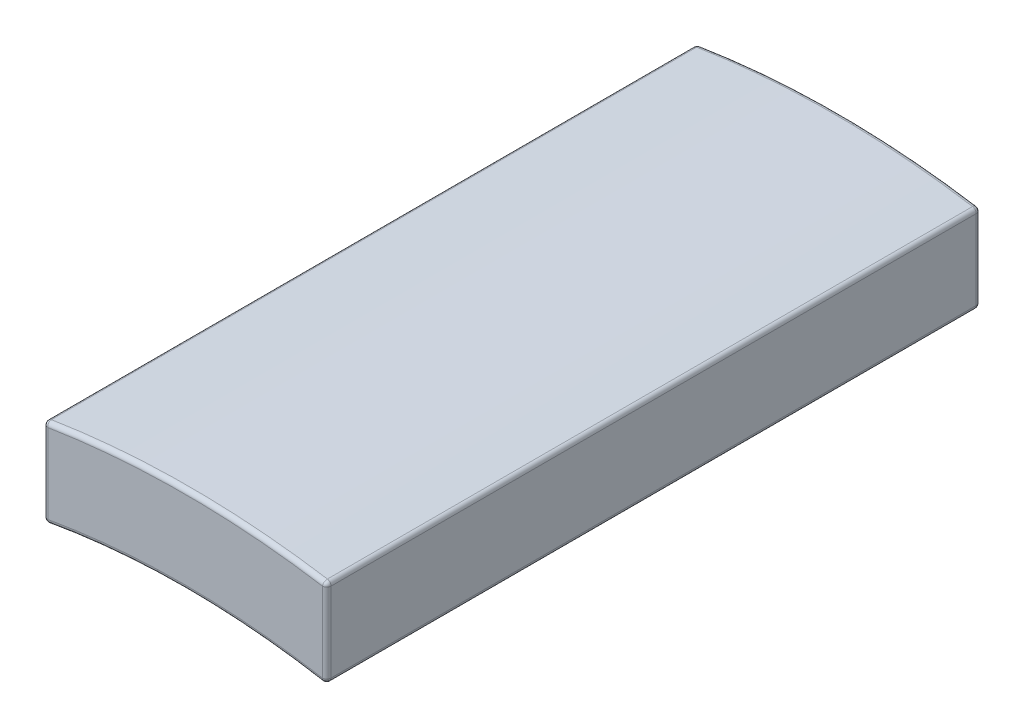
ISO-10303-21;
HEADER;
FILE_DESCRIPTION(('STEP AP214'),'2;1');
FILE_NAME('part.step','',(''),(''),'','','');
FILE_SCHEMA(('AUTOMOTIVE_DESIGN { 1 0 10303 214 1 1 1 1 }'));
ENDSEC;
DATA;
#1=APPLICATION_CONTEXT('core data for automotive mechanical design processes');
#2=APPLICATION_PROTOCOL_DEFINITION('international standard','automotive_design',2000,#1);
#3=PRODUCT_CONTEXT('',#1,'mechanical');
#4=PRODUCT('Part','Part','',(#3));
#5=PRODUCT_RELATED_PRODUCT_CATEGORY('part','',(#4));
#6=PRODUCT_DEFINITION_FORMATION('','',#4);
#7=PRODUCT_DEFINITION_CONTEXT('part definition',#1,'design');
#8=PRODUCT_DEFINITION('design','',#6,#7);
#9=PRODUCT_DEFINITION_SHAPE('','',#8);
#10=(LENGTH_UNIT() NAMED_UNIT(*) SI_UNIT(.MILLI.,.METRE.));
#11=(NAMED_UNIT(*) PLANE_ANGLE_UNIT() SI_UNIT($,.RADIAN.));
#12=(NAMED_UNIT(*) SI_UNIT($,.STERADIAN.) SOLID_ANGLE_UNIT());
#13=UNCERTAINTY_MEASURE_WITH_UNIT(LENGTH_MEASURE(1.E-05),#10,'distance_accuracy_value','');
#14=(GEOMETRIC_REPRESENTATION_CONTEXT(3) GLOBAL_UNCERTAINTY_ASSIGNED_CONTEXT((#13)) GLOBAL_UNIT_ASSIGNED_CONTEXT((#10,
#11,#12)) REPRESENTATION_CONTEXT('',''));
#15=CARTESIAN_POINT('',(0.,0.,0.));
#16=DIRECTION('',(0.,0.,1.));
#17=DIRECTION('',(1.,0.,0.));
#18=AXIS2_PLACEMENT_3D('',#15,#16,#17);
#19=CARTESIAN_POINT('',(0.,0.,0.1));
#20=DIRECTION('',(0.,0.,1.));
#21=DIRECTION('',(1.,0.,0.));
#22=AXIS2_PLACEMENT_3D('',#19,#20,#21);
#23=TOROIDAL_SURFACE('',#22,18.15,0.1);
#24=CARTESIAN_POINT('',(-3.15,17.8745629317195,0.1));
#25=DIRECTION('',(0.984824403951484,0.173553719008276,0.));
#26=DIRECTION('',(-0.173553719008276,0.984824403951484,0.));
#27=AXIS2_PLACEMENT_3D('',#24,#25,#26);
#28=CIRCLE('',#27,0.1);
#29=CARTESIAN_POINT('',(-3.13264462809917,17.7760804913244,0.1));
#30=VERTEX_POINT('',#29);
#31=CARTESIAN_POINT('',(-3.15,17.8745629317195,0.));
#32=VERTEX_POINT('',#31);
#33=EDGE_CURVE('E28',#30,#32,#28,.T.);
#34=ORIENTED_EDGE('',*,*,#33,.T.);
#35=CARTESIAN_POINT('',(0.,0.,0.));
#36=DIRECTION('',(0.,0.,1.));
#37=DIRECTION('',(1.,0.,0.));
#38=AXIS2_PLACEMENT_3D('',#35,#36,#37);
#39=CIRCLE('',#38,18.15);
#40=CARTESIAN_POINT('',(3.15,17.8745629317195,0.));
#41=VERTEX_POINT('',#40);
#42=EDGE_CURVE('E204',#41,#32,#39,.T.);
#43=ORIENTED_EDGE('',*,*,#42,.F.);
#44=CARTESIAN_POINT('',(3.15,17.8745629317195,0.1));
#45=DIRECTION('',(-0.984824403951486,0.173553719008268,0.));
#46=DIRECTION('',(-0.173553719008268,-0.984824403951486,0.));
#47=AXIS2_PLACEMENT_3D('',#44,#45,#46);
#48=CIRCLE('',#47,0.1);
#49=CARTESIAN_POINT('',(3.13264462809917,17.7760804913244,0.1));
#50=VERTEX_POINT('',#49);
#51=EDGE_CURVE('E11',#41,#50,#48,.T.);
#52=ORIENTED_EDGE('',*,*,#51,.T.);
#53=CARTESIAN_POINT('',(0.,0.,0.1));
#54=DIRECTION('',(0.,0.,-1.));
#55=DIRECTION('',(1.,0.,0.));
#56=AXIS2_PLACEMENT_3D('',#53,#54,#55);
#57=CIRCLE('',#56,18.05);
#58=EDGE_CURVE('E199',#30,#50,#57,.T.);
#59=ORIENTED_EDGE('',*,*,#58,.F.);
#60=EDGE_LOOP('',(#34,#43,#52,#59));
#61=FACE_BOUND('',#60,.T.);
#62=ADVANCED_FACE('F17',(#61),#23,.T.);
#63=CARTESIAN_POINT('',(3.15,17.8745629317195,0.1));
#64=DIRECTION('',(0.,1.,0.));
#65=DIRECTION('',(1.,0.,0.));
#66=AXIS2_PLACEMENT_3D('',#63,#64,#65);
#67=SPHERICAL_SURFACE('',#66,0.1);
#68=CARTESIAN_POINT('',(3.15,17.8745629317195,0.1));
#69=DIRECTION('',(0.,-1.,0.));
#70=DIRECTION('',(0.,0.,-1.));
#71=AXIS2_PLACEMENT_3D('',#68,#69,#70);
#72=CIRCLE('',#71,0.1);
#73=CARTESIAN_POINT('',(3.25,17.8745629317195,0.1));
#74=VERTEX_POINT('',#73);
#75=EDGE_CURVE('E242',#41,#74,#72,.T.);
#76=ORIENTED_EDGE('',*,*,#75,.T.);
#77=CARTESIAN_POINT('',(3.15,17.8745629317195,0.1));
#78=DIRECTION('',(0.,0.,1.));
#79=DIRECTION('',(-1.,0.,0.));
#80=AXIS2_PLACEMENT_3D('',#77,#78,#79);
#81=CIRCLE('',#80,0.1);
#82=EDGE_CURVE('E241',#50,#74,#81,.T.);
#83=ORIENTED_EDGE('',*,*,#82,.F.);
#84=ORIENTED_EDGE('',*,*,#51,.F.);
#85=EDGE_LOOP('',(#76,#83,#84));
#86=FACE_BOUND('',#85,.T.);
#87=ADVANCED_FACE('F293',(#86),#67,.T.);
#88=CARTESIAN_POINT('',(-3.15,17.8745629317195,0.1));
#89=DIRECTION('',(0.,1.,0.));
#90=DIRECTION('',(1.,0.,0.));
#91=AXIS2_PLACEMENT_3D('',#88,#89,#90);
#92=SPHERICAL_SURFACE('',#91,0.1);
#93=CARTESIAN_POINT('',(-3.15,17.8745629317195,0.1));
#94=DIRECTION('',(0.,0.,1.));
#95=DIRECTION('',(-1.,0.,0.));
#96=AXIS2_PLACEMENT_3D('',#93,#94,#95);
#97=CIRCLE('',#96,0.1);
#98=CARTESIAN_POINT('',(-3.25,17.8745629317195,0.1));
#99=VERTEX_POINT('',#98);
#100=EDGE_CURVE('E196',#99,#30,#97,.T.);
#101=ORIENTED_EDGE('',*,*,#100,.F.);
#102=CARTESIAN_POINT('',(-3.15,17.8745629317195,0.1));
#103=DIRECTION('',(0.,-1.,0.));
#104=DIRECTION('',(0.,0.,-1.));
#105=AXIS2_PLACEMENT_3D('',#102,#103,#104);
#106=CIRCLE('',#105,0.1);
#107=EDGE_CURVE('E140',#99,#32,#106,.T.);
#108=ORIENTED_EDGE('',*,*,#107,.T.);
#109=ORIENTED_EDGE('',*,*,#33,.F.);
#110=EDGE_LOOP('',(#101,#108,#109));
#111=FACE_BOUND('',#110,.T.);
#112=ADVANCED_FACE('F515',(#111),#92,.T.);
#113=CARTESIAN_POINT('',(3.15,17.8745629317195,0.1));
#114=DIRECTION('',(0.,1.,0.));
#115=DIRECTION('',(0.,0.,1.));
#116=AXIS2_PLACEMENT_3D('',#113,#114,#115);
#117=CYLINDRICAL_SURFACE('',#116,0.1);
#118=CARTESIAN_POINT('',(3.15,19.6997461912584,0.1));
#119=DIRECTION('',(0.,-1.,0.));
#120=DIRECTION('',(0.,0.,-1.));
#121=AXIS2_PLACEMENT_3D('',#118,#119,#120);
#122=CIRCLE('',#121,0.1);
#123=CARTESIAN_POINT('',(3.15,19.6997461912584,0.));
#124=VERTEX_POINT('',#123);
#125=CARTESIAN_POINT('',(3.25,19.6997461912584,0.1));
#126=VERTEX_POINT('',#125);
#127=EDGE_CURVE('E132',#124,#126,#122,.T.);
#128=ORIENTED_EDGE('',*,*,#127,.T.);
#129=DIRECTION('',(0.,1.,0.));
#130=VECTOR('',#129,1.);
#131=CARTESIAN_POINT('',(3.25,17.8745629317195,0.1));
#132=LINE('',#131,#130);
#133=EDGE_CURVE('E273',#74,#126,#132,.T.);
#134=ORIENTED_EDGE('',*,*,#133,.F.);
#135=ORIENTED_EDGE('',*,*,#75,.F.);
#136=DIRECTION('',(0.,-1.,0.));
#137=VECTOR('',#136,1.);
#138=CARTESIAN_POINT('',(3.15,17.8745629317195,0.));
#139=LINE('',#138,#137);
#140=EDGE_CURVE('E214',#124,#41,#139,.T.);
#141=ORIENTED_EDGE('',*,*,#140,.F.);
#142=EDGE_LOOP('',(#128,#134,#135,#141));
#143=FACE_BOUND('',#142,.T.);
#144=ADVANCED_FACE('F299',(#143),#117,.T.);
#145=CARTESIAN_POINT('',(-3.15,17.8745629317195,0.1));
#146=DIRECTION('',(0.,-1.,0.));
#147=DIRECTION('',(0.,0.,-1.));
#148=AXIS2_PLACEMENT_3D('',#145,#146,#147);
#149=CYLINDRICAL_SURFACE('',#148,0.1);
#150=CARTESIAN_POINT('',(-3.15,19.6997461912584,0.1));
#151=DIRECTION('',(0.,-1.,0.));
#152=DIRECTION('',(0.,0.,-1.));
#153=AXIS2_PLACEMENT_3D('',#150,#151,#152);
#154=CIRCLE('',#153,0.1);
#155=CARTESIAN_POINT('',(-3.25,19.6997461912584,0.1));
#156=VERTEX_POINT('',#155);
#157=CARTESIAN_POINT('',(-3.15,19.6997461912584,0.));
#158=VERTEX_POINT('',#157);
#159=EDGE_CURVE('E43',#156,#158,#154,.T.);
#160=ORIENTED_EDGE('',*,*,#159,.T.);
#161=DIRECTION('',(0.,1.,0.));
#162=VECTOR('',#161,1.);
#163=CARTESIAN_POINT('',(-3.15,17.8745629317195,0.));
#164=LINE('',#163,#162);
#165=EDGE_CURVE('E200',#32,#158,#164,.T.);
#166=ORIENTED_EDGE('',*,*,#165,.F.);
#167=ORIENTED_EDGE('',*,*,#107,.F.);
#168=DIRECTION('',(0.,-1.,0.));
#169=VECTOR('',#168,1.);
#170=CARTESIAN_POINT('',(-3.25,17.8745629317195,0.1));
#171=LINE('',#170,#169);
#172=EDGE_CURVE('E136',#156,#99,#171,.T.);
#173=ORIENTED_EDGE('',*,*,#172,.F.);
#174=EDGE_LOOP('',(#160,#166,#167,#173));
#175=FACE_BOUND('',#174,.T.);
#176=ADVANCED_FACE('F138',(#175),#149,.T.);
#177=CARTESIAN_POINT('',(3.15,19.6997461912584,0.1));
#178=DIRECTION('',(0.,1.,0.));
#179=DIRECTION('',(1.,0.,0.));
#180=AXIS2_PLACEMENT_3D('',#177,#178,#179);
#181=SPHERICAL_SURFACE('',#180,0.1);
#182=CARTESIAN_POINT('',(3.15,19.6997461912584,0.1));
#183=DIRECTION('',(0.987455949436511,-0.157894736842109,0.));
#184=DIRECTION('',(0.157894736842109,0.987455949436511,0.));
#185=AXIS2_PLACEMENT_3D('',#182,#183,#184);
#186=CIRCLE('',#185,0.1);
#187=CARTESIAN_POINT('',(3.16578947368421,19.798491786202,0.1));
#188=VERTEX_POINT('',#187);
#189=EDGE_CURVE('E133',#124,#188,#186,.T.);
#190=ORIENTED_EDGE('',*,*,#189,.T.);
#191=CARTESIAN_POINT('',(3.15,19.6997461912584,0.1));
#192=DIRECTION('',(0.,0.,1.));
#193=DIRECTION('',(-1.,0.,0.));
#194=AXIS2_PLACEMENT_3D('',#191,#192,#193);
#195=CIRCLE('',#194,0.0999999999999981);
#196=EDGE_CURVE('E184',#126,#188,#195,.T.);
#197=ORIENTED_EDGE('',*,*,#196,.F.);
#198=ORIENTED_EDGE('',*,*,#127,.F.);
#199=EDGE_LOOP('',(#190,#197,#198));
#200=FACE_BOUND('',#199,.T.);
#201=ADVANCED_FACE('F492',(#200),#181,.T.);
#202=CARTESIAN_POINT('',(-3.15,19.6997461912584,0.1));
#203=DIRECTION('',(0.,1.,0.));
#204=DIRECTION('',(1.,0.,0.));
#205=AXIS2_PLACEMENT_3D('',#202,#203,#204);
#206=SPHERICAL_SURFACE('',#205,0.1);
#207=CARTESIAN_POINT('',(-3.15,19.6997461912584,0.1));
#208=DIRECTION('',(0.,0.,1.));
#209=DIRECTION('',(-1.,0.,0.));
#210=AXIS2_PLACEMENT_3D('',#207,#208,#209);
#211=CIRCLE('',#210,0.0999999999999981);
#212=CARTESIAN_POINT('',(-3.16578947368421,19.798491786202,0.1));
#213=VERTEX_POINT('',#212);
#214=EDGE_CURVE('E128',#213,#156,#211,.T.);
#215=ORIENTED_EDGE('',*,*,#214,.F.);
#216=CARTESIAN_POINT('',(-3.15,19.6997461912584,0.1));
#217=DIRECTION('',(-0.987455949436512,-0.157894736842104,0.));
#218=DIRECTION('',(0.157894736842104,-0.987455949436512,0.));
#219=AXIS2_PLACEMENT_3D('',#216,#217,#218);
#220=CIRCLE('',#219,0.1);
#221=EDGE_CURVE('E21',#213,#158,#220,.T.);
#222=ORIENTED_EDGE('',*,*,#221,.T.);
#223=ORIENTED_EDGE('',*,*,#159,.F.);
#224=EDGE_LOOP('',(#215,#222,#223));
#225=FACE_BOUND('',#224,.T.);
#226=ADVANCED_FACE('F126',(#225),#206,.T.);
#227=CARTESIAN_POINT('',(0.,0.,0.1));
#228=DIRECTION('',(0.,0.,1.));
#229=DIRECTION('',(1.,0.,0.));
#230=AXIS2_PLACEMENT_3D('',#227,#228,#229);
#231=TOROIDAL_SURFACE('',#230,19.95,0.1);
#232=ORIENTED_EDGE('',*,*,#221,.F.);
#233=CARTESIAN_POINT('',(0.,0.,0.1));
#234=DIRECTION('',(0.,0.,1.));
#235=DIRECTION('',(1.,0.,0.));
#236=AXIS2_PLACEMENT_3D('',#233,#234,#235);
#237=CIRCLE('',#236,20.05);
#238=EDGE_CURVE('E245',#188,#213,#237,.T.);
#239=ORIENTED_EDGE('',*,*,#238,.F.);
#240=ORIENTED_EDGE('',*,*,#189,.F.);
#241=CARTESIAN_POINT('',(0.,0.,0.));
#242=DIRECTION('',(0.,0.,-1.));
#243=DIRECTION('',(1.,0.,0.));
#244=AXIS2_PLACEMENT_3D('',#241,#242,#243);
#245=CIRCLE('',#244,19.95);
#246=EDGE_CURVE('E203',#158,#124,#245,.T.);
#247=ORIENTED_EDGE('',*,*,#246,.F.);
#248=EDGE_LOOP('',(#232,#239,#240,#247));
#249=FACE_BOUND('',#248,.T.);
#250=ADVANCED_FACE('F491',(#249),#231,.T.);
#251=CARTESIAN_POINT('',(-3.15,17.8745629317195,14.9));
#252=DIRECTION('',(0.,1.,0.));
#253=DIRECTION('',(0.,0.,1.));
#254=AXIS2_PLACEMENT_3D('',#251,#252,#253);
#255=CYLINDRICAL_SURFACE('',#254,0.1);
#256=CARTESIAN_POINT('',(-3.15,19.6997461912584,14.9));
#257=DIRECTION('',(0.,-1.,0.));
#258=DIRECTION('',(0.,0.,-1.));
#259=AXIS2_PLACEMENT_3D('',#256,#257,#258);
#260=CIRCLE('',#259,0.1);
#261=CARTESIAN_POINT('',(-3.15,19.6997461912584,15.));
#262=VERTEX_POINT('',#261);
#263=CARTESIAN_POINT('',(-3.25,19.6997461912584,14.9));
#264=VERTEX_POINT('',#263);
#265=EDGE_CURVE('E235',#262,#264,#260,.T.);
#266=ORIENTED_EDGE('',*,*,#265,.T.);
#267=DIRECTION('',(0.,1.,0.));
#268=VECTOR('',#267,1.);
#269=CARTESIAN_POINT('',(-3.25,19.6997461912584,14.9));
#270=LINE('',#269,#268);
#271=CARTESIAN_POINT('',(-3.25,17.8745629317195,14.9));
#272=VERTEX_POINT('',#271);
#273=EDGE_CURVE('E145',#272,#264,#270,.T.);
#274=ORIENTED_EDGE('',*,*,#273,.F.);
#275=CARTESIAN_POINT('',(-3.15,17.8745629317195,14.9));
#276=DIRECTION('',(0.,1.,0.));
#277=DIRECTION('',(0.,0.,1.));
#278=AXIS2_PLACEMENT_3D('',#275,#276,#277);
#279=CIRCLE('',#278,0.1);
#280=CARTESIAN_POINT('',(-3.15,17.8745629317195,15.));
#281=VERTEX_POINT('',#280);
#282=EDGE_CURVE('E233',#272,#281,#279,.T.);
#283=ORIENTED_EDGE('',*,*,#282,.T.);
#284=DIRECTION('',(0.,-1.,0.));
#285=VECTOR('',#284,1.);
#286=CARTESIAN_POINT('',(-3.15,17.8745629317195,15.));
#287=LINE('',#286,#285);
#288=EDGE_CURVE('E185',#262,#281,#287,.T.);
#289=ORIENTED_EDGE('',*,*,#288,.F.);
#290=EDGE_LOOP('',(#266,#274,#283,#289));
#291=FACE_BOUND('',#290,.T.);
#292=ADVANCED_FACE('F600',(#291),#255,.T.);
#293=CARTESIAN_POINT('',(-3.15,17.8745629317195,14.9));
#294=DIRECTION('',(0.,1.,0.));
#295=DIRECTION('',(1.,0.,0.));
#296=AXIS2_PLACEMENT_3D('',#293,#294,#295);
#297=SPHERICAL_SURFACE('',#296,0.1);
#298=CARTESIAN_POINT('',(-3.15,17.8745629317195,14.9));
#299=DIRECTION('',(0.,0.,-1.));
#300=DIRECTION('',(-1.,0.,0.));
#301=AXIS2_PLACEMENT_3D('',#298,#299,#300);
#302=CIRCLE('',#301,0.1);
#303=CARTESIAN_POINT('',(-3.13264462809917,17.7760804913244,14.9));
#304=VERTEX_POINT('',#303);
#305=EDGE_CURVE('E195',#304,#272,#302,.T.);
#306=ORIENTED_EDGE('',*,*,#305,.F.);
#307=CARTESIAN_POINT('',(-3.15,17.8745629317195,14.9));
#308=DIRECTION('',(-0.984824403951486,-0.173553719008264,0.));
#309=DIRECTION('',(0.173553719008264,-0.984824403951486,0.));
#310=AXIS2_PLACEMENT_3D('',#307,#308,#309);
#311=CIRCLE('',#310,0.1);
#312=EDGE_CURVE('E172',#304,#281,#311,.T.);
#313=ORIENTED_EDGE('',*,*,#312,.T.);
#314=ORIENTED_EDGE('',*,*,#282,.F.);
#315=EDGE_LOOP('',(#306,#313,#314));
#316=FACE_BOUND('',#315,.T.);
#317=ADVANCED_FACE('F625',(#316),#297,.T.);
#318=CARTESIAN_POINT('',(-3.15,19.6997461912584,14.9));
#319=DIRECTION('',(0.,1.,0.));
#320=DIRECTION('',(1.,0.,0.));
#321=AXIS2_PLACEMENT_3D('',#318,#319,#320);
#322=SPHERICAL_SURFACE('',#321,0.1);
#323=CARTESIAN_POINT('',(-3.15,19.6997461912584,14.9));
#324=DIRECTION('',(-0.987455949436513,-0.157894736842095,0.));
#325=DIRECTION('',(0.157894736842095,-0.987455949436513,0.));
#326=AXIS2_PLACEMENT_3D('',#323,#324,#325);
#327=CIRCLE('',#326,0.1);
#328=CARTESIAN_POINT('',(-3.16578947368421,19.798491786202,14.9));
#329=VERTEX_POINT('',#328);
#330=EDGE_CURVE('E175',#262,#329,#327,.T.);
#331=ORIENTED_EDGE('',*,*,#330,.T.);
#332=CARTESIAN_POINT('',(-3.15,19.6997461912584,14.9));
#333=DIRECTION('',(0.,0.,-1.));
#334=DIRECTION('',(-1.,0.,0.));
#335=AXIS2_PLACEMENT_3D('',#332,#333,#334);
#336=CIRCLE('',#335,0.0999999999999981);
#337=EDGE_CURVE('E146',#264,#329,#336,.T.);
#338=ORIENTED_EDGE('',*,*,#337,.F.);
#339=ORIENTED_EDGE('',*,*,#265,.F.);
#340=EDGE_LOOP('',(#331,#338,#339));
#341=FACE_BOUND('',#340,.T.);
#342=ADVANCED_FACE('F630',(#341),#322,.T.);
#343=CARTESIAN_POINT('',(0.,0.,14.9));
#344=DIRECTION('',(0.,0.,1.));
#345=DIRECTION('',(1.,0.,0.));
#346=AXIS2_PLACEMENT_3D('',#343,#344,#345);
#347=TOROIDAL_SURFACE('',#346,18.15,0.1);
#348=CARTESIAN_POINT('',(3.15,17.8745629317195,14.9));
#349=DIRECTION('',(-0.984824403951486,0.173553719008268,0.));
#350=DIRECTION('',(-0.173553719008268,-0.984824403951486,0.));
#351=AXIS2_PLACEMENT_3D('',#348,#349,#350);
#352=CIRCLE('',#351,0.1);
#353=CARTESIAN_POINT('',(3.13264462809917,17.7760804913244,14.9));
#354=VERTEX_POINT('',#353);
#355=CARTESIAN_POINT('',(3.15,17.8745629317195,15.));
#356=VERTEX_POINT('',#355);
#357=EDGE_CURVE('E178',#354,#356,#352,.T.);
#358=ORIENTED_EDGE('',*,*,#357,.T.);
#359=CARTESIAN_POINT('',(0.,0.,15.));
#360=DIRECTION('',(0.,0.,-1.));
#361=DIRECTION('',(1.,0.,0.));
#362=AXIS2_PLACEMENT_3D('',#359,#360,#361);
#363=CIRCLE('',#362,18.15);
#364=EDGE_CURVE('E189',#281,#356,#363,.T.);
#365=ORIENTED_EDGE('',*,*,#364,.F.);
#366=ORIENTED_EDGE('',*,*,#312,.F.);
#367=CARTESIAN_POINT('',(0.,0.,14.9));
#368=DIRECTION('',(0.,0.,1.));
#369=DIRECTION('',(1.,0.,0.));
#370=AXIS2_PLACEMENT_3D('',#367,#368,#369);
#371=CIRCLE('',#370,18.05);
#372=EDGE_CURVE('E255',#354,#304,#371,.T.);
#373=ORIENTED_EDGE('',*,*,#372,.F.);
#374=EDGE_LOOP('',(#358,#365,#366,#373));
#375=FACE_BOUND('',#374,.T.);
#376=ADVANCED_FACE('F528',(#375),#347,.T.);
#377=CARTESIAN_POINT('',(0.,0.,14.9));
#378=DIRECTION('',(0.,0.,1.));
#379=DIRECTION('',(1.,0.,0.));
#380=AXIS2_PLACEMENT_3D('',#377,#378,#379);
#381=TOROIDAL_SURFACE('',#380,19.95,0.1);
#382=CARTESIAN_POINT('',(3.15,19.6997461912584,14.9));
#383=DIRECTION('',(-0.987455949436511,0.157894736842109,0.));
#384=DIRECTION('',(-0.157894736842109,-0.987455949436511,0.));
#385=AXIS2_PLACEMENT_3D('',#382,#383,#384);
#386=CIRCLE('',#385,0.1);
#387=CARTESIAN_POINT('',(3.15,19.6997461912584,15.));
#388=VERTEX_POINT('',#387);
#389=CARTESIAN_POINT('',(3.16578947368421,19.798491786202,14.9));
#390=VERTEX_POINT('',#389);
#391=EDGE_CURVE('E232',#388,#390,#386,.T.);
#392=ORIENTED_EDGE('',*,*,#391,.T.);
#393=CARTESIAN_POINT('',(0.,0.,14.9));
#394=DIRECTION('',(0.,0.,-1.));
#395=DIRECTION('',(1.,0.,0.));
#396=AXIS2_PLACEMENT_3D('',#393,#394,#395);
#397=CIRCLE('',#396,20.05);
#398=EDGE_CURVE('E163',#329,#390,#397,.T.);
#399=ORIENTED_EDGE('',*,*,#398,.F.);
#400=ORIENTED_EDGE('',*,*,#330,.F.);
#401=CARTESIAN_POINT('',(0.,0.,15.));
#402=DIRECTION('',(0.,0.,1.));
#403=DIRECTION('',(1.,0.,0.));
#404=AXIS2_PLACEMENT_3D('',#401,#402,#403);
#405=CIRCLE('',#404,19.95);
#406=EDGE_CURVE('E190',#388,#262,#405,.T.);
#407=ORIENTED_EDGE('',*,*,#406,.F.);
#408=EDGE_LOOP('',(#392,#399,#400,#407));
#409=FACE_BOUND('',#408,.T.);
#410=ADVANCED_FACE('F523',(#409),#381,.T.);
#411=CARTESIAN_POINT('',(3.15,17.8745629317195,14.9));
#412=DIRECTION('',(0.,1.,0.));
#413=DIRECTION('',(1.,0.,0.));
#414=AXIS2_PLACEMENT_3D('',#411,#412,#413);
#415=SPHERICAL_SURFACE('',#414,0.1);
#416=CARTESIAN_POINT('',(3.15,17.8745629317195,14.9));
#417=DIRECTION('',(0.,0.,-1.));
#418=DIRECTION('',(-1.,0.,0.));
#419=AXIS2_PLACEMENT_3D('',#416,#417,#418);
#420=CIRCLE('',#419,0.1);
#421=CARTESIAN_POINT('',(3.25,17.8745629317195,14.9));
#422=VERTEX_POINT('',#421);
#423=EDGE_CURVE('E225',#422,#354,#420,.T.);
#424=ORIENTED_EDGE('',*,*,#423,.F.);
#425=CARTESIAN_POINT('',(3.15,17.8745629317195,14.9));
#426=DIRECTION('',(0.,-1.,0.));
#427=DIRECTION('',(0.,0.,-1.));
#428=AXIS2_PLACEMENT_3D('',#425,#426,#427);
#429=CIRCLE('',#428,0.1);
#430=EDGE_CURVE('E212',#422,#356,#429,.T.);
#431=ORIENTED_EDGE('',*,*,#430,.T.);
#432=ORIENTED_EDGE('',*,*,#357,.F.);
#433=EDGE_LOOP('',(#424,#431,#432));
#434=FACE_BOUND('',#433,.T.);
#435=ADVANCED_FACE('F312',(#434),#415,.T.);
#436=CARTESIAN_POINT('',(3.15,19.6997461912584,14.9));
#437=DIRECTION('',(0.,1.,0.));
#438=DIRECTION('',(1.,0.,0.));
#439=AXIS2_PLACEMENT_3D('',#436,#437,#438);
#440=SPHERICAL_SURFACE('',#439,0.1);
#441=CARTESIAN_POINT('',(3.15,19.6997461912584,14.9));
#442=DIRECTION('',(0.,1.,0.));
#443=DIRECTION('',(0.,0.,1.));
#444=AXIS2_PLACEMENT_3D('',#441,#442,#443);
#445=CIRCLE('',#444,0.1);
#446=CARTESIAN_POINT('',(3.25,19.6997461912584,14.9));
#447=VERTEX_POINT('',#446);
#448=EDGE_CURVE('E254',#388,#447,#445,.T.);
#449=ORIENTED_EDGE('',*,*,#448,.T.);
#450=CARTESIAN_POINT('',(3.15,19.6997461912584,14.9));
#451=DIRECTION('',(0.,0.,-1.));
#452=DIRECTION('',(-1.,0.,0.));
#453=AXIS2_PLACEMENT_3D('',#450,#451,#452);
#454=CIRCLE('',#453,0.0999999999999981);
#455=EDGE_CURVE('E183',#390,#447,#454,.T.);
#456=ORIENTED_EDGE('',*,*,#455,.F.);
#457=ORIENTED_EDGE('',*,*,#391,.F.);
#458=EDGE_LOOP('',(#449,#456,#457));
#459=FACE_BOUND('',#458,.T.);
#460=ADVANCED_FACE('F540',(#459),#440,.T.);
#461=CARTESIAN_POINT('',(3.15,17.8745629317195,14.9));
#462=DIRECTION('',(0.,-1.,0.));
#463=DIRECTION('',(0.,0.,-1.));
#464=AXIS2_PLACEMENT_3D('',#461,#462,#463);
#465=CYLINDRICAL_SURFACE('',#464,0.1);
#466=ORIENTED_EDGE('',*,*,#430,.F.);
#467=DIRECTION('',(0.,-1.,0.));
#468=VECTOR('',#467,1.);
#469=CARTESIAN_POINT('',(3.25,17.8745629317195,14.9));
#470=LINE('',#469,#468);
#471=EDGE_CURVE('E263',#447,#422,#470,.T.);
#472=ORIENTED_EDGE('',*,*,#471,.F.);
#473=ORIENTED_EDGE('',*,*,#448,.F.);
#474=DIRECTION('',(0.,1.,0.));
#475=VECTOR('',#474,1.);
#476=CARTESIAN_POINT('',(3.15,19.6997461912584,15.));
#477=LINE('',#476,#475);
#478=EDGE_CURVE('E221',#356,#388,#477,.T.);
#479=ORIENTED_EDGE('',*,*,#478,.F.);
#480=EDGE_LOOP('',(#466,#472,#473,#479));
#481=FACE_BOUND('',#480,.T.);
#482=ADVANCED_FACE('F657',(#481),#465,.T.);
#483=CARTESIAN_POINT('',(-3.15,17.8745629317195,0.));
#484=DIRECTION('',(0.,0.,1.));
#485=DIRECTION('',(1.,0.,0.));
#486=AXIS2_PLACEMENT_3D('',#483,#484,#485);
#487=PLANE('',#486);
#488=ORIENTED_EDGE('',*,*,#140,.T.);
#489=ORIENTED_EDGE('',*,*,#42,.T.);
#490=ORIENTED_EDGE('',*,*,#165,.T.);
#491=ORIENTED_EDGE('',*,*,#246,.T.);
#492=EDGE_LOOP('',(#488,#489,#490,#491));
#493=FACE_BOUND('',#492,.T.);
#494=ADVANCED_FACE('F662',(#493),#487,.F.);
#495=CARTESIAN_POINT('',(-3.15,17.8745629317195,15.));
#496=DIRECTION('',(0.,0.,1.));
#497=DIRECTION('',(1.,0.,0.));
#498=AXIS2_PLACEMENT_3D('',#495,#496,#497);
#499=PLANE('',#498);
#500=ORIENTED_EDGE('',*,*,#406,.T.);
#501=ORIENTED_EDGE('',*,*,#288,.T.);
#502=ORIENTED_EDGE('',*,*,#364,.T.);
#503=ORIENTED_EDGE('',*,*,#478,.T.);
#504=EDGE_LOOP('',(#500,#501,#502,#503));
#505=FACE_BOUND('',#504,.T.);
#506=ADVANCED_FACE('F19',(#505),#499,.T.);
#507=CARTESIAN_POINT('',(-3.25,17.8745629317195,15.));
#508=DIRECTION('',(1.,0.,0.));
#509=DIRECTION('',(0.,1.,0.));
#510=AXIS2_PLACEMENT_3D('',#507,#508,#509);
#511=PLANE('',#510);
#512=DIRECTION('',(0.,0.,-1.));
#513=VECTOR('',#512,1.);
#514=CARTESIAN_POINT('',(-3.25,19.6997461912584,15.));
#515=LINE('',#514,#513);
#516=EDGE_CURVE('E150',#264,#156,#515,.T.);
#517=ORIENTED_EDGE('',*,*,#516,.T.);
#518=ORIENTED_EDGE('',*,*,#172,.T.);
#519=DIRECTION('',(0.,0.,-1.));
#520=VECTOR('',#519,1.);
#521=CARTESIAN_POINT('',(-3.25,17.8745629317195,15.));
#522=LINE('',#521,#520);
#523=EDGE_CURVE('E881',#272,#99,#522,.T.);
#524=ORIENTED_EDGE('',*,*,#523,.F.);
#525=ORIENTED_EDGE('',*,*,#273,.T.);
#526=EDGE_LOOP('',(#517,#518,#524,#525));
#527=FACE_BOUND('',#526,.T.);
#528=ADVANCED_FACE('F151',(#527),#511,.F.);
#529=CARTESIAN_POINT('',(-3.15,19.6997461912584,15.));
#530=DIRECTION('',(0.,0.,-1.));
#531=DIRECTION('',(-1.,0.,0.));
#532=AXIS2_PLACEMENT_3D('',#529,#530,#531);
#533=CYLINDRICAL_SURFACE('',#532,0.0999999999999981);
#534=DIRECTION('',(0.,0.,-1.));
#535=VECTOR('',#534,1.);
#536=CARTESIAN_POINT('',(-3.16578947368421,19.798491786202,15.));
#537=LINE('',#536,#535);
#538=EDGE_CURVE('E160',#329,#213,#537,.T.);
#539=ORIENTED_EDGE('',*,*,#538,.T.);
#540=ORIENTED_EDGE('',*,*,#214,.T.);
#541=ORIENTED_EDGE('',*,*,#516,.F.);
#542=ORIENTED_EDGE('',*,*,#337,.T.);
#543=EDGE_LOOP('',(#539,#540,#541,#542));
#544=FACE_BOUND('',#543,.T.);
#545=ADVANCED_FACE('F158',(#544),#533,.T.);
#546=CARTESIAN_POINT('',(0.,0.,15.));
#547=DIRECTION('',(0.,0.,-1.));
#548=DIRECTION('',(-1.,0.,0.));
#549=AXIS2_PLACEMENT_3D('',#546,#547,#548);
#550=CYLINDRICAL_SURFACE('',#549,20.05);
#551=DIRECTION('',(0.,0.,-1.));
#552=VECTOR('',#551,1.);
#553=CARTESIAN_POINT('',(3.16578947368421,19.798491786202,15.));
#554=LINE('',#553,#552);
#555=EDGE_CURVE('E179',#390,#188,#554,.T.);
#556=ORIENTED_EDGE('',*,*,#555,.T.);
#557=ORIENTED_EDGE('',*,*,#238,.T.);
#558=ORIENTED_EDGE('',*,*,#538,.F.);
#559=ORIENTED_EDGE('',*,*,#398,.T.);
#560=EDGE_LOOP('',(#556,#557,#558,#559));
#561=FACE_BOUND('',#560,.T.);
#562=ADVANCED_FACE('F561',(#561),#550,.T.);
#563=CARTESIAN_POINT('',(3.15,19.6997461912584,15.));
#564=DIRECTION('',(0.,0.,-1.));
#565=DIRECTION('',(-1.,0.,0.));
#566=AXIS2_PLACEMENT_3D('',#563,#564,#565);
#567=CYLINDRICAL_SURFACE('',#566,0.0999999999999981);
#568=DIRECTION('',(0.,0.,-1.));
#569=VECTOR('',#568,1.);
#570=CARTESIAN_POINT('',(3.25,19.6997461912584,15.));
#571=LINE('',#570,#569);
#572=EDGE_CURVE('E269',#447,#126,#571,.T.);
#573=ORIENTED_EDGE('',*,*,#572,.T.);
#574=ORIENTED_EDGE('',*,*,#196,.T.);
#575=ORIENTED_EDGE('',*,*,#555,.F.);
#576=ORIENTED_EDGE('',*,*,#455,.T.);
#577=EDGE_LOOP('',(#573,#574,#575,#576));
#578=FACE_BOUND('',#577,.T.);
#579=ADVANCED_FACE('F556',(#578),#567,.T.);
#580=CARTESIAN_POINT('',(3.25,17.8745629317195,15.));
#581=DIRECTION('',(-1.,0.,0.));
#582=DIRECTION('',(0.,0.,1.));
#583=AXIS2_PLACEMENT_3D('',#580,#581,#582);
#584=PLANE('',#583);
#585=DIRECTION('',(0.,0.,-1.));
#586=VECTOR('',#585,1.);
#587=CARTESIAN_POINT('',(3.25,17.8745629317195,15.));
#588=LINE('',#587,#586);
#589=EDGE_CURVE('E237',#422,#74,#588,.T.);
#590=ORIENTED_EDGE('',*,*,#589,.T.);
#591=ORIENTED_EDGE('',*,*,#133,.T.);
#592=ORIENTED_EDGE('',*,*,#572,.F.);
#593=ORIENTED_EDGE('',*,*,#471,.T.);
#594=EDGE_LOOP('',(#590,#591,#592,#593));
#595=FACE_BOUND('',#594,.T.);
#596=ADVANCED_FACE('F305',(#595),#584,.F.);
#597=CARTESIAN_POINT('',(3.15,17.8745629317195,15.));
#598=DIRECTION('',(0.,0.,-1.));
#599=DIRECTION('',(-1.,0.,0.));
#600=AXIS2_PLACEMENT_3D('',#597,#598,#599);
#601=CYLINDRICAL_SURFACE('',#600,0.1);
#602=DIRECTION('',(0.,0.,-1.));
#603=VECTOR('',#602,1.);
#604=CARTESIAN_POINT('',(3.13264462809917,17.7760804913244,15.));
#605=LINE('',#604,#603);
#606=EDGE_CURVE('E258',#354,#50,#605,.T.);
#607=ORIENTED_EDGE('',*,*,#606,.T.);
#608=ORIENTED_EDGE('',*,*,#82,.T.);
#609=ORIENTED_EDGE('',*,*,#589,.F.);
#610=ORIENTED_EDGE('',*,*,#423,.T.);
#611=EDGE_LOOP('',(#607,#608,#609,#610));
#612=FACE_BOUND('',#611,.T.);
#613=ADVANCED_FACE('F288',(#612),#601,.T.);
#614=CARTESIAN_POINT('',(0.,0.,15.));
#615=DIRECTION('',(0.,0.,-1.));
#616=DIRECTION('',(-1.,0.,0.));
#617=AXIS2_PLACEMENT_3D('',#614,#615,#616);
#618=CYLINDRICAL_SURFACE('',#617,18.05);
#619=DIRECTION('',(0.,0.,-1.));
#620=VECTOR('',#619,1.);
#621=CARTESIAN_POINT('',(-3.13264462809917,17.7760804913244,15.));
#622=LINE('',#621,#620);
#623=EDGE_CURVE('E191',#304,#30,#622,.T.);
#624=ORIENTED_EDGE('',*,*,#623,.T.);
#625=ORIENTED_EDGE('',*,*,#58,.T.);
#626=ORIENTED_EDGE('',*,*,#606,.F.);
#627=ORIENTED_EDGE('',*,*,#372,.T.);
#628=EDGE_LOOP('',(#624,#625,#626,#627));
#629=FACE_BOUND('',#628,.T.);
#630=ADVANCED_FACE('F479',(#629),#618,.F.);
#631=CARTESIAN_POINT('',(-3.15,17.8745629317195,15.));
#632=DIRECTION('',(0.,0.,-1.));
#633=DIRECTION('',(-1.,0.,0.));
#634=AXIS2_PLACEMENT_3D('',#631,#632,#633);
#635=CYLINDRICAL_SURFACE('',#634,0.1);
#636=ORIENTED_EDGE('',*,*,#523,.T.);
#637=ORIENTED_EDGE('',*,*,#100,.T.);
#638=ORIENTED_EDGE('',*,*,#623,.F.);
#639=ORIENTED_EDGE('',*,*,#305,.T.);
#640=EDGE_LOOP('',(#636,#637,#638,#639));
#641=FACE_BOUND('',#640,.T.);
#642=ADVANCED_FACE('F500',(#641),#635,.T.);
#643=CLOSED_SHELL('',(#62,#87,#112,#144,#176,#201,#226,#250,#292,#317,#342,#376,#410,#435,#460,
#482,#494,#506,#528,#545,#562,#579,#596,#613,#630,#642));
#644=MANIFOLD_SOLID_BREP('B1',#643);
#645=ADVANCED_BREP_SHAPE_REPRESENTATION('',(#18,#644),#14);
#646=SHAPE_DEFINITION_REPRESENTATION(#9,#645);
ENDSEC;
END-ISO-10303-21;
